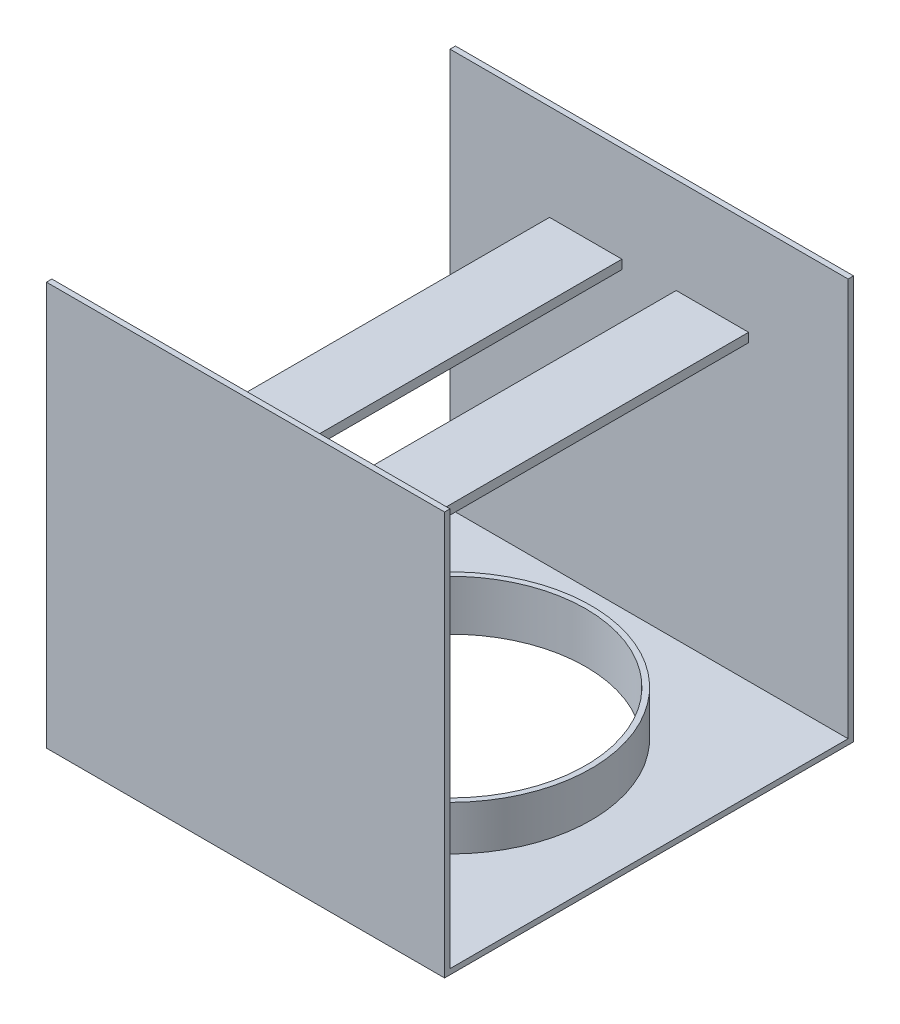
ISO-10303-21;
HEADER;
FILE_DESCRIPTION(('STEP AP214'),'2;1');
FILE_NAME('part.step','',(''),(''),'','','');
FILE_SCHEMA(('AUTOMOTIVE_DESIGN { 1 0 10303 214 1 1 1 1 }'));
ENDSEC;
DATA;
#1=APPLICATION_CONTEXT('core data for automotive mechanical design processes');
#2=APPLICATION_PROTOCOL_DEFINITION('international standard','automotive_design',2000,#1);
#3=PRODUCT_CONTEXT('',#1,'mechanical');
#4=PRODUCT('Part','Part','',(#3));
#5=PRODUCT_RELATED_PRODUCT_CATEGORY('part','',(#4));
#6=PRODUCT_DEFINITION_FORMATION('','',#4);
#7=PRODUCT_DEFINITION_CONTEXT('part definition',#1,'design');
#8=PRODUCT_DEFINITION('design','',#6,#7);
#9=PRODUCT_DEFINITION_SHAPE('','',#8);
#10=(LENGTH_UNIT() NAMED_UNIT(*) SI_UNIT(.MILLI.,.METRE.));
#11=(NAMED_UNIT(*) PLANE_ANGLE_UNIT() SI_UNIT($,.RADIAN.));
#12=(NAMED_UNIT(*) SI_UNIT($,.STERADIAN.) SOLID_ANGLE_UNIT());
#13=UNCERTAINTY_MEASURE_WITH_UNIT(LENGTH_MEASURE(1.E-05),#10,'distance_accuracy_value','');
#14=(GEOMETRIC_REPRESENTATION_CONTEXT(3) GLOBAL_UNCERTAINTY_ASSIGNED_CONTEXT((#13)) GLOBAL_UNIT_ASSIGNED_CONTEXT((#10,
#11,#12)) REPRESENTATION_CONTEXT('',''));
#15=CARTESIAN_POINT('',(0.,0.,0.));
#16=DIRECTION('',(0.,0.,1.));
#17=DIRECTION('',(1.,0.,0.));
#18=AXIS2_PLACEMENT_3D('',#15,#16,#17);
#19=CARTESIAN_POINT('',(-110.,220.,-113.));
#20=DIRECTION('',(0.,0.,1.));
#21=DIRECTION('',(1.,0.,0.));
#22=AXIS2_PLACEMENT_3D('',#19,#20,#21);
#23=PLANE('',#22);
#24=DIRECTION('',(0.,-1.,0.));
#25=VECTOR('',#24,1.);
#26=CARTESIAN_POINT('',(-110.,220.,-113.));
#27=LINE('',#26,#25);
#28=CARTESIAN_POINT('',(-110.,220.,-113.));
#29=VERTEX_POINT('',#28);
#30=CARTESIAN_POINT('',(-110.,-3.,-113.));
#31=VERTEX_POINT('',#30);
#32=EDGE_CURVE('E221',#29,#31,#27,.T.);
#33=ORIENTED_EDGE('',*,*,#32,.F.);
#34=DIRECTION('',(-1.,0.,0.));
#35=VECTOR('',#34,1.);
#36=CARTESIAN_POINT('',(-110.,220.,-113.));
#37=LINE('',#36,#35);
#38=CARTESIAN_POINT('',(110.,220.,-113.));
#39=VERTEX_POINT('',#38);
#40=EDGE_CURVE('E46',#39,#29,#37,.T.);
#41=ORIENTED_EDGE('',*,*,#40,.F.);
#42=DIRECTION('',(0.,1.,0.));
#43=VECTOR('',#42,1.);
#44=CARTESIAN_POINT('',(110.,220.,-113.));
#45=LINE('',#44,#43);
#46=CARTESIAN_POINT('',(110.,-3.,-113.));
#47=VERTEX_POINT('',#46);
#48=EDGE_CURVE('E232',#47,#39,#45,.T.);
#49=ORIENTED_EDGE('',*,*,#48,.F.);
#50=DIRECTION('',(-1.,0.,0.));
#51=VECTOR('',#50,1.);
#52=CARTESIAN_POINT('',(-110.,-3.,-113.));
#53=LINE('',#52,#51);
#54=EDGE_CURVE('E272',#47,#31,#53,.T.);
#55=ORIENTED_EDGE('',*,*,#54,.T.);
#56=EDGE_LOOP('',(#33,#41,#49,#55));
#57=FACE_BOUND('',#56,.T.);
#58=ADVANCED_FACE('F37',(#57),#23,.F.);
#59=CARTESIAN_POINT('',(-110.,220.,113.));
#60=DIRECTION('',(0.,0.,-1.));
#61=DIRECTION('',(-1.,0.,0.));
#62=AXIS2_PLACEMENT_3D('',#59,#60,#61);
#63=PLANE('',#62);
#64=DIRECTION('',(0.,1.,0.));
#65=VECTOR('',#64,1.);
#66=CARTESIAN_POINT('',(-110.,-3.,113.));
#67=LINE('',#66,#65);
#68=CARTESIAN_POINT('',(-110.,-3.,113.));
#69=VERTEX_POINT('',#68);
#70=CARTESIAN_POINT('',(-110.,220.,113.));
#71=VERTEX_POINT('',#70);
#72=EDGE_CURVE('E225',#69,#71,#67,.T.);
#73=ORIENTED_EDGE('',*,*,#72,.F.);
#74=DIRECTION('',(1.,0.,0.));
#75=VECTOR('',#74,1.);
#76=CARTESIAN_POINT('',(-110.,-3.,113.));
#77=LINE('',#76,#75);
#78=CARTESIAN_POINT('',(110.,-3.,113.));
#79=VERTEX_POINT('',#78);
#80=EDGE_CURVE('E275',#69,#79,#77,.T.);
#81=ORIENTED_EDGE('',*,*,#80,.T.);
#82=DIRECTION('',(0.,-1.,0.));
#83=VECTOR('',#82,1.);
#84=CARTESIAN_POINT('',(110.,-3.,113.));
#85=LINE('',#84,#83);
#86=CARTESIAN_POINT('',(110.,220.,113.));
#87=VERTEX_POINT('',#86);
#88=EDGE_CURVE('E227',#87,#79,#85,.T.);
#89=ORIENTED_EDGE('',*,*,#88,.F.);
#90=DIRECTION('',(1.,0.,0.));
#91=VECTOR('',#90,1.);
#92=CARTESIAN_POINT('',(-110.,220.,113.));
#93=LINE('',#92,#91);
#94=EDGE_CURVE('E11',#71,#87,#93,.T.);
#95=ORIENTED_EDGE('',*,*,#94,.F.);
#96=EDGE_LOOP('',(#73,#81,#89,#95));
#97=FACE_BOUND('',#96,.T.);
#98=ADVANCED_FACE('F300',(#97),#63,.F.);
#99=CARTESIAN_POINT('',(0.,220.,0.));
#100=DIRECTION('',(0.,1.,0.));
#101=DIRECTION('',(0.,0.,1.));
#102=AXIS2_PLACEMENT_3D('',#99,#100,#101);
#103=PLANE('',#102);
#104=ORIENTED_EDGE('',*,*,#40,.T.);
#105=DIRECTION('',(0.,0.,-1.));
#106=VECTOR('',#105,1.);
#107=CARTESIAN_POINT('',(-110.,220.,113.));
#108=LINE('',#107,#106);
#109=CARTESIAN_POINT('',(-110.,220.,-110.));
#110=VERTEX_POINT('',#109);
#111=EDGE_CURVE('E218',#110,#29,#108,.T.);
#112=ORIENTED_EDGE('',*,*,#111,.F.);
#113=DIRECTION('',(-1.,0.,0.));
#114=VECTOR('',#113,1.);
#115=CARTESIAN_POINT('',(-110.,220.,-110.));
#116=LINE('',#115,#114);
#117=CARTESIAN_POINT('',(110.,220.,-110.));
#118=VERTEX_POINT('',#117);
#119=EDGE_CURVE('E244',#118,#110,#116,.T.);
#120=ORIENTED_EDGE('',*,*,#119,.F.);
#121=DIRECTION('',(0.,0.,1.));
#122=VECTOR('',#121,1.);
#123=CARTESIAN_POINT('',(110.,220.,113.));
#124=LINE('',#123,#122);
#125=EDGE_CURVE('E235',#39,#118,#124,.T.);
#126=ORIENTED_EDGE('',*,*,#125,.F.);
#127=EDGE_LOOP('',(#104,#112,#120,#126));
#128=FACE_BOUND('',#127,.T.);
#129=ADVANCED_FACE('F284',(#128),#103,.T.);
#130=DIRECTION('',(1.,0.,0.));
#131=VECTOR('',#130,1.);
#132=CARTESIAN_POINT('',(-110.,220.,110.));
#133=LINE('',#132,#131);
#134=CARTESIAN_POINT('',(-110.,220.,110.));
#135=VERTEX_POINT('',#134);
#136=CARTESIAN_POINT('',(110.,220.,110.));
#137=VERTEX_POINT('',#136);
#138=EDGE_CURVE('E247',#135,#137,#133,.T.);
#139=ORIENTED_EDGE('',*,*,#138,.F.);
#140=EDGE_CURVE('E219',#71,#135,#108,.T.);
#141=ORIENTED_EDGE('',*,*,#140,.F.);
#142=ORIENTED_EDGE('',*,*,#94,.T.);
#143=EDGE_CURVE('E234',#137,#87,#124,.T.);
#144=ORIENTED_EDGE('',*,*,#143,.F.);
#145=EDGE_LOOP('',(#139,#141,#142,#144));
#146=FACE_BOUND('',#145,.T.);
#147=ADVANCED_FACE('F308',(#146),#103,.T.);
#148=CARTESIAN_POINT('',(0.,-3.,0.));
#149=DIRECTION('',(0.,1.,0.));
#150=DIRECTION('',(0.,0.,1.));
#151=AXIS2_PLACEMENT_3D('',#148,#149,#150);
#152=PLANE('',#151);
#153=CARTESIAN_POINT('',(0.,-3.,0.));
#154=DIRECTION('',(0.,1.,0.));
#155=DIRECTION('',(0.,0.,1.));
#156=AXIS2_PLACEMENT_3D('',#153,#154,#155);
#157=CIRCLE('',#156,75.);
#158=CARTESIAN_POINT('',(0.,-3.,75.));
#159=VERTEX_POINT('',#158);
#160=EDGE_CURVE('E271',#159,#159,#157,.T.);
#161=ORIENTED_EDGE('',*,*,#160,.T.);
#162=EDGE_LOOP('',(#161));
#163=FACE_BOUND('',#162,.T.);
#164=DIRECTION('',(0.,0.,1.));
#165=VECTOR('',#164,1.);
#166=CARTESIAN_POINT('',(-110.,-3.,-113.));
#167=LINE('',#166,#165);
#168=EDGE_CURVE('E223',#31,#69,#167,.T.);
#169=ORIENTED_EDGE('',*,*,#168,.F.);
#170=ORIENTED_EDGE('',*,*,#54,.F.);
#171=DIRECTION('',(0.,0.,-1.));
#172=VECTOR('',#171,1.);
#173=CARTESIAN_POINT('',(110.,-3.,-113.));
#174=LINE('',#173,#172);
#175=EDGE_CURVE('E230',#79,#47,#174,.T.);
#176=ORIENTED_EDGE('',*,*,#175,.F.);
#177=ORIENTED_EDGE('',*,*,#80,.F.);
#178=EDGE_LOOP('',(#169,#170,#176,#177));
#179=FACE_BOUND('',#178,.T.);
#180=ADVANCED_FACE('F296',(#163,#179),#152,.F.);
#181=CARTESIAN_POINT('',(0.,240.,0.));
#182=DIRECTION('',(0.,-1.,0.));
#183=DIRECTION('',(0.,0.,-1.));
#184=AXIS2_PLACEMENT_3D('',#181,#182,#183);
#185=CYLINDRICAL_SURFACE('',#184,75.);
#186=ORIENTED_EDGE('',*,*,#160,.F.);
#187=EDGE_LOOP('',(#186));
#188=FACE_BOUND('',#187,.T.);
#189=CARTESIAN_POINT('',(0.,24.7155714285709,0.));
#190=DIRECTION('',(0.,1.,0.));
#191=DIRECTION('',(0.,0.,1.));
#192=AXIS2_PLACEMENT_3D('',#189,#190,#191);
#193=CIRCLE('',#192,75.);
#194=CARTESIAN_POINT('',(0.,24.7155714285709,75.));
#195=VERTEX_POINT('',#194);
#196=EDGE_CURVE('E237',#195,#195,#193,.T.);
#197=ORIENTED_EDGE('',*,*,#196,.T.);
#198=EDGE_LOOP('',(#197));
#199=FACE_BOUND('',#198,.T.);
#200=ADVANCED_FACE('F39',(#188,#199),#185,.F.);
#201=CARTESIAN_POINT('',(0.,240.,0.));
#202=DIRECTION('',(0.,-1.,0.));
#203=DIRECTION('',(0.,0.,-1.));
#204=AXIS2_PLACEMENT_3D('',#201,#202,#203);
#205=CYLINDRICAL_SURFACE('',#204,78.);
#206=CARTESIAN_POINT('',(0.,0.,0.));
#207=DIRECTION('',(0.,1.,0.));
#208=DIRECTION('',(0.,0.,1.));
#209=AXIS2_PLACEMENT_3D('',#206,#207,#208);
#210=CIRCLE('',#209,78.);
#211=CARTESIAN_POINT('',(0.,0.,78.));
#212=VERTEX_POINT('',#211);
#213=EDGE_CURVE('E240',#212,#212,#210,.T.);
#214=ORIENTED_EDGE('',*,*,#213,.T.);
#215=EDGE_LOOP('',(#214));
#216=FACE_BOUND('',#215,.T.);
#217=CARTESIAN_POINT('',(0.,24.7155714285709,0.));
#218=DIRECTION('',(0.,1.,0.));
#219=DIRECTION('',(0.,0.,1.));
#220=AXIS2_PLACEMENT_3D('',#217,#218,#219);
#221=CIRCLE('',#220,78.);
#222=CARTESIAN_POINT('',(0.,24.7155714285709,78.));
#223=VERTEX_POINT('',#222);
#224=EDGE_CURVE('E41',#223,#223,#221,.T.);
#225=ORIENTED_EDGE('',*,*,#224,.F.);
#226=EDGE_LOOP('',(#225));
#227=FACE_BOUND('',#226,.T.);
#228=ADVANCED_FACE('F320',(#216,#227),#205,.T.);
#229=CARTESIAN_POINT('',(-110.,220.,-110.));
#230=DIRECTION('',(0.,0.,1.));
#231=DIRECTION('',(1.,0.,0.));
#232=AXIS2_PLACEMENT_3D('',#229,#230,#231);
#233=PLANE('',#232);
#234=DIRECTION('',(1.,0.,0.));
#235=VECTOR('',#234,1.);
#236=CARTESIAN_POINT('',(55.,167.,-110.));
#237=LINE('',#236,#235);
#238=CARTESIAN_POINT('',(15.,167.,-110.));
#239=VERTEX_POINT('',#238);
#240=CARTESIAN_POINT('',(55.,167.,-110.));
#241=VERTEX_POINT('',#240);
#242=EDGE_CURVE('E53',#239,#241,#237,.T.);
#243=ORIENTED_EDGE('',*,*,#242,.T.);
#244=DIRECTION('',(0.,-1.,0.));
#245=VECTOR('',#244,1.);
#246=CARTESIAN_POINT('',(55.,162.,-110.));
#247=LINE('',#246,#245);
#248=CARTESIAN_POINT('',(55.,162.,-110.));
#249=VERTEX_POINT('',#248);
#250=EDGE_CURVE('E57',#241,#249,#247,.T.);
#251=ORIENTED_EDGE('',*,*,#250,.T.);
#252=DIRECTION('',(-1.,0.,0.));
#253=VECTOR('',#252,1.);
#254=CARTESIAN_POINT('',(15.,162.,-110.));
#255=LINE('',#254,#253);
#256=CARTESIAN_POINT('',(15.,162.,-110.));
#257=VERTEX_POINT('',#256);
#258=EDGE_CURVE('E145',#249,#257,#255,.T.);
#259=ORIENTED_EDGE('',*,*,#258,.T.);
#260=DIRECTION('',(0.,1.,0.));
#261=VECTOR('',#260,1.);
#262=CARTESIAN_POINT('',(15.,167.,-110.));
#263=LINE('',#262,#261);
#264=EDGE_CURVE('E150',#257,#239,#263,.T.);
#265=ORIENTED_EDGE('',*,*,#264,.T.);
#266=EDGE_LOOP('',(#243,#251,#259,#265));
#267=FACE_BOUND('',#266,.T.);
#268=DIRECTION('',(0.,-1.,0.));
#269=VECTOR('',#268,1.);
#270=CARTESIAN_POINT('',(-15.,162.,-110.));
#271=LINE('',#270,#269);
#272=CARTESIAN_POINT('',(-15.,167.,-110.));
#273=VERTEX_POINT('',#272);
#274=CARTESIAN_POINT('',(-15.,162.,-110.));
#275=VERTEX_POINT('',#274);
#276=EDGE_CURVE('E204',#273,#275,#271,.T.);
#277=ORIENTED_EDGE('',*,*,#276,.T.);
#278=DIRECTION('',(-1.,0.,0.));
#279=VECTOR('',#278,1.);
#280=CARTESIAN_POINT('',(-55.,162.,-110.));
#281=LINE('',#280,#279);
#282=CARTESIAN_POINT('',(-55.,162.,-110.));
#283=VERTEX_POINT('',#282);
#284=EDGE_CURVE('E201',#275,#283,#281,.T.);
#285=ORIENTED_EDGE('',*,*,#284,.T.);
#286=DIRECTION('',(0.,1.,0.));
#287=VECTOR('',#286,1.);
#288=CARTESIAN_POINT('',(-55.,167.,-110.));
#289=LINE('',#288,#287);
#290=CARTESIAN_POINT('',(-55.,167.,-110.));
#291=VERTEX_POINT('',#290);
#292=EDGE_CURVE('E199',#283,#291,#289,.T.);
#293=ORIENTED_EDGE('',*,*,#292,.T.);
#294=DIRECTION('',(1.,0.,0.));
#295=VECTOR('',#294,1.);
#296=CARTESIAN_POINT('',(-15.,167.,-110.));
#297=LINE('',#296,#295);
#298=EDGE_CURVE('E206',#291,#273,#297,.T.);
#299=ORIENTED_EDGE('',*,*,#298,.T.);
#300=EDGE_LOOP('',(#277,#285,#293,#299));
#301=FACE_BOUND('',#300,.T.);
#302=DIRECTION('',(-1.,0.,0.));
#303=VECTOR('',#302,1.);
#304=CARTESIAN_POINT('',(-110.,0.,-110.));
#305=LINE('',#304,#303);
#306=CARTESIAN_POINT('',(110.,0.,-110.));
#307=VERTEX_POINT('',#306);
#308=CARTESIAN_POINT('',(-110.,0.,-110.));
#309=VERTEX_POINT('',#308);
#310=EDGE_CURVE('E254',#307,#309,#305,.T.);
#311=ORIENTED_EDGE('',*,*,#310,.F.);
#312=DIRECTION('',(0.,-1.,0.));
#313=VECTOR('',#312,1.);
#314=CARTESIAN_POINT('',(110.,220.,-110.));
#315=LINE('',#314,#313);
#316=EDGE_CURVE('E269',#118,#307,#315,.T.);
#317=ORIENTED_EDGE('',*,*,#316,.F.);
#318=ORIENTED_EDGE('',*,*,#119,.T.);
#319=DIRECTION('',(0.,-1.,0.));
#320=VECTOR('',#319,1.);
#321=CARTESIAN_POINT('',(-110.,220.,-110.));
#322=LINE('',#321,#320);
#323=EDGE_CURVE('E266',#110,#309,#322,.T.);
#324=ORIENTED_EDGE('',*,*,#323,.T.);
#325=EDGE_LOOP('',(#311,#317,#318,#324));
#326=FACE_BOUND('',#325,.T.);
#327=ADVANCED_FACE('F147',(#267,#301,#326),#233,.T.);
#328=CARTESIAN_POINT('',(-110.,220.,110.));
#329=DIRECTION('',(0.,0.,-1.));
#330=DIRECTION('',(-1.,0.,0.));
#331=AXIS2_PLACEMENT_3D('',#328,#329,#330);
#332=PLANE('',#331);
#333=DIRECTION('',(1.,0.,0.));
#334=VECTOR('',#333,1.);
#335=CARTESIAN_POINT('',(55.,167.,110.));
#336=LINE('',#335,#334);
#337=CARTESIAN_POINT('',(15.,167.,110.));
#338=VERTEX_POINT('',#337);
#339=CARTESIAN_POINT('',(55.,167.,110.));
#340=VERTEX_POINT('',#339);
#341=EDGE_CURVE('E172',#338,#340,#336,.T.);
#342=ORIENTED_EDGE('',*,*,#341,.F.);
#343=DIRECTION('',(0.,1.,0.));
#344=VECTOR('',#343,1.);
#345=CARTESIAN_POINT('',(15.,167.,110.));
#346=LINE('',#345,#344);
#347=CARTESIAN_POINT('',(15.,162.,110.));
#348=VERTEX_POINT('',#347);
#349=EDGE_CURVE('E184',#348,#338,#346,.T.);
#350=ORIENTED_EDGE('',*,*,#349,.F.);
#351=DIRECTION('',(-1.,0.,0.));
#352=VECTOR('',#351,1.);
#353=CARTESIAN_POINT('',(15.,162.,110.));
#354=LINE('',#353,#352);
#355=CARTESIAN_POINT('',(55.,162.,110.));
#356=VERTEX_POINT('',#355);
#357=EDGE_CURVE('E160',#356,#348,#354,.T.);
#358=ORIENTED_EDGE('',*,*,#357,.F.);
#359=DIRECTION('',(0.,-1.,0.));
#360=VECTOR('',#359,1.);
#361=CARTESIAN_POINT('',(55.,162.,110.));
#362=LINE('',#361,#360);
#363=EDGE_CURVE('E178',#340,#356,#362,.T.);
#364=ORIENTED_EDGE('',*,*,#363,.F.);
#365=EDGE_LOOP('',(#342,#350,#358,#364));
#366=FACE_BOUND('',#365,.T.);
#367=DIRECTION('',(0.,-1.,0.));
#368=VECTOR('',#367,1.);
#369=CARTESIAN_POINT('',(-15.,162.,110.));
#370=LINE('',#369,#368);
#371=CARTESIAN_POINT('',(-15.,167.,110.));
#372=VERTEX_POINT('',#371);
#373=CARTESIAN_POINT('',(-15.,162.,110.));
#374=VERTEX_POINT('',#373);
#375=EDGE_CURVE('E193',#372,#374,#370,.T.);
#376=ORIENTED_EDGE('',*,*,#375,.F.);
#377=DIRECTION('',(1.,0.,0.));
#378=VECTOR('',#377,1.);
#379=CARTESIAN_POINT('',(-15.,167.,110.));
#380=LINE('',#379,#378);
#381=CARTESIAN_POINT('',(-55.,167.,110.));
#382=VERTEX_POINT('',#381);
#383=EDGE_CURVE('E190',#382,#372,#380,.T.);
#384=ORIENTED_EDGE('',*,*,#383,.F.);
#385=DIRECTION('',(0.,1.,0.));
#386=VECTOR('',#385,1.);
#387=CARTESIAN_POINT('',(-55.,167.,110.));
#388=LINE('',#387,#386);
#389=CARTESIAN_POINT('',(-55.,162.,110.));
#390=VERTEX_POINT('',#389);
#391=EDGE_CURVE('E187',#390,#382,#388,.T.);
#392=ORIENTED_EDGE('',*,*,#391,.F.);
#393=DIRECTION('',(-1.,0.,0.));
#394=VECTOR('',#393,1.);
#395=CARTESIAN_POINT('',(-55.,162.,110.));
#396=LINE('',#395,#394);
#397=EDGE_CURVE('E181',#374,#390,#396,.T.);
#398=ORIENTED_EDGE('',*,*,#397,.F.);
#399=EDGE_LOOP('',(#376,#384,#392,#398));
#400=FACE_BOUND('',#399,.T.);
#401=DIRECTION('',(1.,0.,0.));
#402=VECTOR('',#401,1.);
#403=CARTESIAN_POINT('',(-110.,0.,110.));
#404=LINE('',#403,#402);
#405=CARTESIAN_POINT('',(-110.,0.,110.));
#406=VERTEX_POINT('',#405);
#407=CARTESIAN_POINT('',(110.,0.,110.));
#408=VERTEX_POINT('',#407);
#409=EDGE_CURVE('E248',#406,#408,#404,.T.);
#410=ORIENTED_EDGE('',*,*,#409,.F.);
#411=DIRECTION('',(0.,-1.,0.));
#412=VECTOR('',#411,1.);
#413=CARTESIAN_POINT('',(-110.,220.,110.));
#414=LINE('',#413,#412);
#415=EDGE_CURVE('E264',#135,#406,#414,.T.);
#416=ORIENTED_EDGE('',*,*,#415,.F.);
#417=ORIENTED_EDGE('',*,*,#138,.T.);
#418=DIRECTION('',(0.,-1.,0.));
#419=VECTOR('',#418,1.);
#420=CARTESIAN_POINT('',(110.,220.,110.));
#421=LINE('',#420,#419);
#422=EDGE_CURVE('E251',#137,#408,#421,.T.);
#423=ORIENTED_EDGE('',*,*,#422,.T.);
#424=EDGE_LOOP('',(#410,#416,#417,#423));
#425=FACE_BOUND('',#424,.T.);
#426=ADVANCED_FACE('F313',(#366,#400,#425),#332,.T.);
#427=CARTESIAN_POINT('',(0.,0.,0.));
#428=DIRECTION('',(0.,1.,0.));
#429=DIRECTION('',(0.,0.,1.));
#430=AXIS2_PLACEMENT_3D('',#427,#428,#429);
#431=PLANE('',#430);
#432=ORIENTED_EDGE('',*,*,#213,.F.);
#433=EDGE_LOOP('',(#432));
#434=FACE_BOUND('',#433,.T.);
#435=DIRECTION('',(0.,0.,-1.));
#436=VECTOR('',#435,1.);
#437=CARTESIAN_POINT('',(110.,0.,-110.));
#438=LINE('',#437,#436);
#439=EDGE_CURVE('E243',#408,#307,#438,.T.);
#440=ORIENTED_EDGE('',*,*,#439,.T.);
#441=ORIENTED_EDGE('',*,*,#310,.T.);
#442=DIRECTION('',(0.,0.,1.));
#443=VECTOR('',#442,1.);
#444=CARTESIAN_POINT('',(-110.,0.,-110.));
#445=LINE('',#444,#443);
#446=EDGE_CURVE('E257',#309,#406,#445,.T.);
#447=ORIENTED_EDGE('',*,*,#446,.T.);
#448=ORIENTED_EDGE('',*,*,#409,.T.);
#449=EDGE_LOOP('',(#440,#441,#447,#448));
#450=FACE_BOUND('',#449,.T.);
#451=ADVANCED_FACE('F315',(#434,#450),#431,.T.);
#452=CARTESIAN_POINT('',(-101.999999999999,24.7155714285709,-105.552744897959));
#453=DIRECTION('',(0.,1.,0.));
#454=DIRECTION('',(0.,0.,1.));
#455=AXIS2_PLACEMENT_3D('',#452,#453,#454);
#456=PLANE('',#455);
#457=ORIENTED_EDGE('',*,*,#196,.F.);
#458=EDGE_LOOP('',(#457));
#459=FACE_BOUND('',#458,.T.);
#460=ORIENTED_EDGE('',*,*,#224,.T.);
#461=EDGE_LOOP('',(#460));
#462=FACE_BOUND('',#461,.T.);
#463=ADVANCED_FACE('F348',(#459,#462),#456,.T.);
#464=CARTESIAN_POINT('',(110.,0.,0.));
#465=DIRECTION('',(-1.,0.,0.));
#466=DIRECTION('',(0.,0.,1.));
#467=AXIS2_PLACEMENT_3D('',#464,#465,#466);
#468=PLANE('',#467);
#469=ORIENTED_EDGE('',*,*,#316,.T.);
#470=ORIENTED_EDGE('',*,*,#439,.F.);
#471=ORIENTED_EDGE('',*,*,#422,.F.);
#472=ORIENTED_EDGE('',*,*,#143,.T.);
#473=ORIENTED_EDGE('',*,*,#88,.T.);
#474=ORIENTED_EDGE('',*,*,#175,.T.);
#475=ORIENTED_EDGE('',*,*,#48,.T.);
#476=ORIENTED_EDGE('',*,*,#125,.T.);
#477=EDGE_LOOP('',(#469,#470,#471,#472,#473,#474,#475,#476));
#478=FACE_BOUND('',#477,.T.);
#479=ADVANCED_FACE('F304',(#478),#468,.F.);
#480=CARTESIAN_POINT('',(-110.,0.,0.));
#481=DIRECTION('',(-1.,0.,0.));
#482=DIRECTION('',(0.,0.,1.));
#483=AXIS2_PLACEMENT_3D('',#480,#481,#482);
#484=PLANE('',#483);
#485=ORIENTED_EDGE('',*,*,#111,.T.);
#486=ORIENTED_EDGE('',*,*,#32,.T.);
#487=ORIENTED_EDGE('',*,*,#168,.T.);
#488=ORIENTED_EDGE('',*,*,#72,.T.);
#489=ORIENTED_EDGE('',*,*,#140,.T.);
#490=ORIENTED_EDGE('',*,*,#415,.T.);
#491=ORIENTED_EDGE('',*,*,#446,.F.);
#492=ORIENTED_EDGE('',*,*,#323,.F.);
#493=EDGE_LOOP('',(#485,#486,#487,#488,#489,#490,#491,#492));
#494=FACE_BOUND('',#493,.T.);
#495=ADVANCED_FACE('F292',(#494),#484,.T.);
#496=CARTESIAN_POINT('',(-15.,162.,-150.311288741493));
#497=DIRECTION('',(1.,0.,0.));
#498=DIRECTION('',(0.,0.,-1.));
#499=AXIS2_PLACEMENT_3D('',#496,#497,#498);
#500=PLANE('',#499);
#501=ORIENTED_EDGE('',*,*,#276,.F.);
#502=DIRECTION('',(0.,0.,1.));
#503=VECTOR('',#502,1.);
#504=CARTESIAN_POINT('',(-15.,167.,-150.311288741493));
#505=LINE('',#504,#503);
#506=EDGE_CURVE('E196',#273,#372,#505,.T.);
#507=ORIENTED_EDGE('',*,*,#506,.T.);
#508=ORIENTED_EDGE('',*,*,#375,.T.);
#509=DIRECTION('',(0.,0.,1.));
#510=VECTOR('',#509,1.);
#511=CARTESIAN_POINT('',(-15.,162.,-150.311288741493));
#512=LINE('',#511,#510);
#513=EDGE_CURVE('E202',#275,#374,#512,.T.);
#514=ORIENTED_EDGE('',*,*,#513,.F.);
#515=EDGE_LOOP('',(#501,#507,#508,#514));
#516=FACE_BOUND('',#515,.T.);
#517=ADVANCED_FACE('F365',(#516),#500,.T.);
#518=CARTESIAN_POINT('',(-55.,162.,-150.311288741493));
#519=DIRECTION('',(0.,-1.,0.));
#520=DIRECTION('',(0.,0.,-1.));
#521=AXIS2_PLACEMENT_3D('',#518,#519,#520);
#522=PLANE('',#521);
#523=ORIENTED_EDGE('',*,*,#284,.F.);
#524=ORIENTED_EDGE('',*,*,#513,.T.);
#525=ORIENTED_EDGE('',*,*,#397,.T.);
#526=DIRECTION('',(0.,0.,1.));
#527=VECTOR('',#526,1.);
#528=CARTESIAN_POINT('',(-55.,162.,-150.311288741493));
#529=LINE('',#528,#527);
#530=EDGE_CURVE('E209',#283,#390,#529,.T.);
#531=ORIENTED_EDGE('',*,*,#530,.F.);
#532=EDGE_LOOP('',(#523,#524,#525,#531));
#533=FACE_BOUND('',#532,.T.);
#534=ADVANCED_FACE('F368',(#533),#522,.T.);
#535=CARTESIAN_POINT('',(-55.,167.,-150.311288741493));
#536=DIRECTION('',(-1.,0.,0.));
#537=DIRECTION('',(0.,0.,1.));
#538=AXIS2_PLACEMENT_3D('',#535,#536,#537);
#539=PLANE('',#538);
#540=ORIENTED_EDGE('',*,*,#292,.F.);
#541=ORIENTED_EDGE('',*,*,#530,.T.);
#542=ORIENTED_EDGE('',*,*,#391,.T.);
#543=DIRECTION('',(0.,0.,1.));
#544=VECTOR('',#543,1.);
#545=CARTESIAN_POINT('',(-55.,167.,-150.311288741493));
#546=LINE('',#545,#544);
#547=EDGE_CURVE('E212',#291,#382,#546,.T.);
#548=ORIENTED_EDGE('',*,*,#547,.F.);
#549=EDGE_LOOP('',(#540,#541,#542,#548));
#550=FACE_BOUND('',#549,.T.);
#551=ADVANCED_FACE('F374',(#550),#539,.T.);
#552=CARTESIAN_POINT('',(-15.,167.,-150.311288741493));
#553=DIRECTION('',(0.,1.,0.));
#554=DIRECTION('',(0.,0.,1.));
#555=AXIS2_PLACEMENT_3D('',#552,#553,#554);
#556=PLANE('',#555);
#557=ORIENTED_EDGE('',*,*,#298,.F.);
#558=ORIENTED_EDGE('',*,*,#547,.T.);
#559=ORIENTED_EDGE('',*,*,#383,.T.);
#560=ORIENTED_EDGE('',*,*,#506,.F.);
#561=EDGE_LOOP('',(#557,#558,#559,#560));
#562=FACE_BOUND('',#561,.T.);
#563=ADVANCED_FACE('F370',(#562),#556,.T.);
#564=CARTESIAN_POINT('',(55.,167.,-150.311288741493));
#565=DIRECTION('',(0.,1.,0.));
#566=DIRECTION('',(0.,0.,1.));
#567=AXIS2_PLACEMENT_3D('',#564,#565,#566);
#568=PLANE('',#567);
#569=ORIENTED_EDGE('',*,*,#242,.F.);
#570=DIRECTION('',(0.,0.,1.));
#571=VECTOR('',#570,1.);
#572=CARTESIAN_POINT('',(15.,167.,-150.311288741493));
#573=LINE('',#572,#571);
#574=EDGE_CURVE('E163',#239,#338,#573,.T.);
#575=ORIENTED_EDGE('',*,*,#574,.T.);
#576=ORIENTED_EDGE('',*,*,#341,.T.);
#577=DIRECTION('',(0.,0.,1.));
#578=VECTOR('',#577,1.);
#579=CARTESIAN_POINT('',(55.,167.,-150.311288741493));
#580=LINE('',#579,#578);
#581=EDGE_CURVE('E154',#241,#340,#580,.T.);
#582=ORIENTED_EDGE('',*,*,#581,.F.);
#583=EDGE_LOOP('',(#569,#575,#576,#582));
#584=FACE_BOUND('',#583,.T.);
#585=ADVANCED_FACE('F373',(#584),#568,.T.);
#586=CARTESIAN_POINT('',(55.,162.,-150.311288741493));
#587=DIRECTION('',(1.,0.,0.));
#588=DIRECTION('',(0.,0.,-1.));
#589=AXIS2_PLACEMENT_3D('',#586,#587,#588);
#590=PLANE('',#589);
#591=ORIENTED_EDGE('',*,*,#250,.F.);
#592=ORIENTED_EDGE('',*,*,#581,.T.);
#593=ORIENTED_EDGE('',*,*,#363,.T.);
#594=DIRECTION('',(0.,0.,1.));
#595=VECTOR('',#594,1.);
#596=CARTESIAN_POINT('',(55.,162.,-150.311288741493));
#597=LINE('',#596,#595);
#598=EDGE_CURVE('E164',#249,#356,#597,.T.);
#599=ORIENTED_EDGE('',*,*,#598,.F.);
#600=EDGE_LOOP('',(#591,#592,#593,#599));
#601=FACE_BOUND('',#600,.T.);
#602=ADVANCED_FACE('F382',(#601),#590,.T.);
#603=CARTESIAN_POINT('',(15.,162.,-150.311288741493));
#604=DIRECTION('',(0.,-1.,0.));
#605=DIRECTION('',(0.,0.,-1.));
#606=AXIS2_PLACEMENT_3D('',#603,#604,#605);
#607=PLANE('',#606);
#608=ORIENTED_EDGE('',*,*,#258,.F.);
#609=ORIENTED_EDGE('',*,*,#598,.T.);
#610=ORIENTED_EDGE('',*,*,#357,.T.);
#611=DIRECTION('',(0.,0.,1.));
#612=VECTOR('',#611,1.);
#613=CARTESIAN_POINT('',(15.,162.,-150.311288741493));
#614=LINE('',#613,#612);
#615=EDGE_CURVE('E158',#257,#348,#614,.T.);
#616=ORIENTED_EDGE('',*,*,#615,.F.);
#617=EDGE_LOOP('',(#608,#609,#610,#616));
#618=FACE_BOUND('',#617,.T.);
#619=ADVANCED_FACE('F159',(#618),#607,.T.);
#620=CARTESIAN_POINT('',(15.,167.,-150.311288741493));
#621=DIRECTION('',(-1.,0.,0.));
#622=DIRECTION('',(0.,0.,1.));
#623=AXIS2_PLACEMENT_3D('',#620,#621,#622);
#624=PLANE('',#623);
#625=ORIENTED_EDGE('',*,*,#264,.F.);
#626=ORIENTED_EDGE('',*,*,#615,.T.);
#627=ORIENTED_EDGE('',*,*,#349,.T.);
#628=ORIENTED_EDGE('',*,*,#574,.F.);
#629=EDGE_LOOP('',(#625,#626,#627,#628));
#630=FACE_BOUND('',#629,.T.);
#631=ADVANCED_FACE('F167',(#630),#624,.T.);
#632=CLOSED_SHELL('',(#58,#98,#129,#147,#180,#200,#228,#327,#426,#451,#463,#479,#495,#517,#534,
#551,#563,#585,#602,#619,#631));
#633=MANIFOLD_SOLID_BREP('B2',#632);
#634=ADVANCED_BREP_SHAPE_REPRESENTATION('',(#18,#633),#14);
#635=SHAPE_DEFINITION_REPRESENTATION(#9,#634);
ENDSEC;
END-ISO-10303-21;
